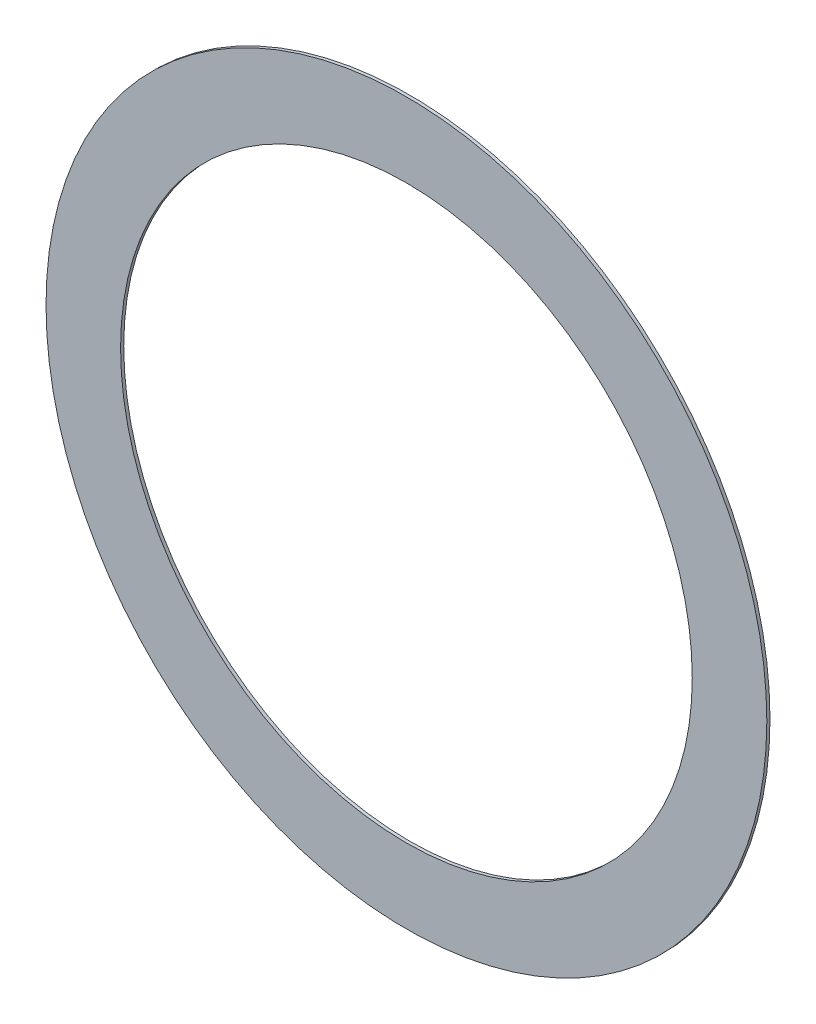
ISO-10303-21;
HEADER;
FILE_DESCRIPTION(('STEP AP214'),'2;1');
FILE_NAME('part.step','',(''),(''),'','','');
FILE_SCHEMA(('AUTOMOTIVE_DESIGN { 1 0 10303 214 1 1 1 1 }'));
ENDSEC;
DATA;
#1=APPLICATION_CONTEXT('core data for automotive mechanical design processes');
#2=APPLICATION_PROTOCOL_DEFINITION('international standard','automotive_design',2000,#1);
#3=PRODUCT_CONTEXT('',#1,'mechanical');
#4=PRODUCT('Part','Part','',(#3));
#5=PRODUCT_RELATED_PRODUCT_CATEGORY('part','',(#4));
#6=PRODUCT_DEFINITION_FORMATION('','',#4);
#7=PRODUCT_DEFINITION_CONTEXT('part definition',#1,'design');
#8=PRODUCT_DEFINITION('design','',#6,#7);
#9=PRODUCT_DEFINITION_SHAPE('','',#8);
#10=(LENGTH_UNIT() NAMED_UNIT(*) SI_UNIT(.MILLI.,.METRE.));
#11=(NAMED_UNIT(*) PLANE_ANGLE_UNIT() SI_UNIT($,.RADIAN.));
#12=(NAMED_UNIT(*) SI_UNIT($,.STERADIAN.) SOLID_ANGLE_UNIT());
#13=UNCERTAINTY_MEASURE_WITH_UNIT(LENGTH_MEASURE(1.E-05),#10,'distance_accuracy_value','');
#14=(GEOMETRIC_REPRESENTATION_CONTEXT(3) GLOBAL_UNCERTAINTY_ASSIGNED_CONTEXT((#13)) GLOBAL_UNIT_ASSIGNED_CONTEXT((#10,
#11,#12)) REPRESENTATION_CONTEXT('',''));
#15=CARTESIAN_POINT('',(0.,0.,0.));
#16=DIRECTION('',(0.,0.,1.));
#17=DIRECTION('',(1.,0.,0.));
#18=AXIS2_PLACEMENT_3D('',#15,#16,#17);
#19=CARTESIAN_POINT('',(0.,0.,0.0127));
#20=DIRECTION('',(0.,0.,1.));
#21=DIRECTION('',(1.,0.,0.));
#22=AXIS2_PLACEMENT_3D('',#19,#20,#21);
#23=PLANE('',#22);
#24=CARTESIAN_POINT('',(-3.0699964,-1.999996,0.0127));
#25=DIRECTION('',(0.,0.,1.));
#26=DIRECTION('',(1.,0.,0.));
#27=AXIS2_PLACEMENT_3D('',#24,#25,#26);
#28=CIRCLE('',#27,1.1500104);
#29=CARTESIAN_POINT('',(-1.919986,-1.999996,0.0127));
#30=VERTEX_POINT('',#29);
#31=EDGE_CURVE('E27',#30,#30,#28,.F.);
#32=ORIENTED_EDGE('',*,*,#31,.T.);
#33=EDGE_LOOP('',(#32));
#34=FACE_BOUND('',#33,.T.);
#35=CARTESIAN_POINT('',(-3.0699964,-1.999996,0.0127));
#36=DIRECTION('',(0.,0.,1.));
#37=DIRECTION('',(1.,0.,0.));
#38=AXIS2_PLACEMENT_3D('',#35,#36,#37);
#39=CIRCLE('',#38,1.4500098);
#40=CARTESIAN_POINT('',(-1.6199866,-1.999996,0.0127));
#41=VERTEX_POINT('',#40);
#42=EDGE_CURVE('E18',#41,#41,#39,.F.);
#43=ORIENTED_EDGE('',*,*,#42,.F.);
#44=EDGE_LOOP('',(#43));
#45=FACE_BOUND('',#44,.T.);
#46=ADVANCED_FACE('F15',(#34,#45),#23,.T.);
#47=CARTESIAN_POINT('',(-3.0699964,-1.999996,0.));
#48=DIRECTION('',(0.,0.,1.));
#49=DIRECTION('',(1.,0.,0.));
#50=AXIS2_PLACEMENT_3D('',#47,#48,#49);
#51=CYLINDRICAL_SURFACE('',#50,1.4500098);
#52=ORIENTED_EDGE('',*,*,#42,.T.);
#53=EDGE_LOOP('',(#52));
#54=FACE_BOUND('',#53,.T.);
#55=CARTESIAN_POINT('',(-3.0699964,-1.999996,0.));
#56=DIRECTION('',(0.,0.,1.));
#57=DIRECTION('',(1.,0.,0.));
#58=AXIS2_PLACEMENT_3D('',#55,#56,#57);
#59=CIRCLE('',#58,1.4500098);
#60=CARTESIAN_POINT('',(-1.6199866,-1.999996,0.));
#61=VERTEX_POINT('',#60);
#62=EDGE_CURVE('E22',#61,#61,#59,.T.);
#63=ORIENTED_EDGE('',*,*,#62,.T.);
#64=EDGE_LOOP('',(#63));
#65=FACE_BOUND('',#64,.T.);
#66=ADVANCED_FACE('F35',(#54,#65),#51,.T.);
#67=CARTESIAN_POINT('',(-3.0699964,-1.999996,0.));
#68=DIRECTION('',(0.,0.,1.));
#69=DIRECTION('',(1.,0.,0.));
#70=AXIS2_PLACEMENT_3D('',#67,#68,#69);
#71=CYLINDRICAL_SURFACE('',#70,1.1500104);
#72=ORIENTED_EDGE('',*,*,#31,.F.);
#73=EDGE_LOOP('',(#72));
#74=FACE_BOUND('',#73,.T.);
#75=CARTESIAN_POINT('',(-3.0699964,-1.999996,0.));
#76=DIRECTION('',(0.,0.,1.));
#77=DIRECTION('',(1.,0.,0.));
#78=AXIS2_PLACEMENT_3D('',#75,#76,#77);
#79=CIRCLE('',#78,1.1500104);
#80=CARTESIAN_POINT('',(-1.919986,-1.999996,0.));
#81=VERTEX_POINT('',#80);
#82=EDGE_CURVE('E10',#81,#81,#79,.F.);
#83=ORIENTED_EDGE('',*,*,#82,.T.);
#84=EDGE_LOOP('',(#83));
#85=FACE_BOUND('',#84,.T.);
#86=ADVANCED_FACE('F43',(#74,#85),#71,.F.);
#87=CARTESIAN_POINT('',(0.,0.,0.));
#88=DIRECTION('',(0.,0.,1.));
#89=DIRECTION('',(1.,0.,0.));
#90=AXIS2_PLACEMENT_3D('',#87,#88,#89);
#91=PLANE('',#90);
#92=ORIENTED_EDGE('',*,*,#82,.F.);
#93=EDGE_LOOP('',(#92));
#94=FACE_BOUND('',#93,.T.);
#95=ORIENTED_EDGE('',*,*,#62,.F.);
#96=EDGE_LOOP('',(#95));
#97=FACE_BOUND('',#96,.T.);
#98=ADVANCED_FACE('F44',(#94,#97),#91,.F.);
#99=CLOSED_SHELL('',(#46,#66,#86,#98));
#100=MANIFOLD_SOLID_BREP('B1',#99);
#101=ADVANCED_BREP_SHAPE_REPRESENTATION('',(#18,#100),#14);
#102=SHAPE_DEFINITION_REPRESENTATION(#9,#101);
ENDSEC;
END-ISO-10303-21;
